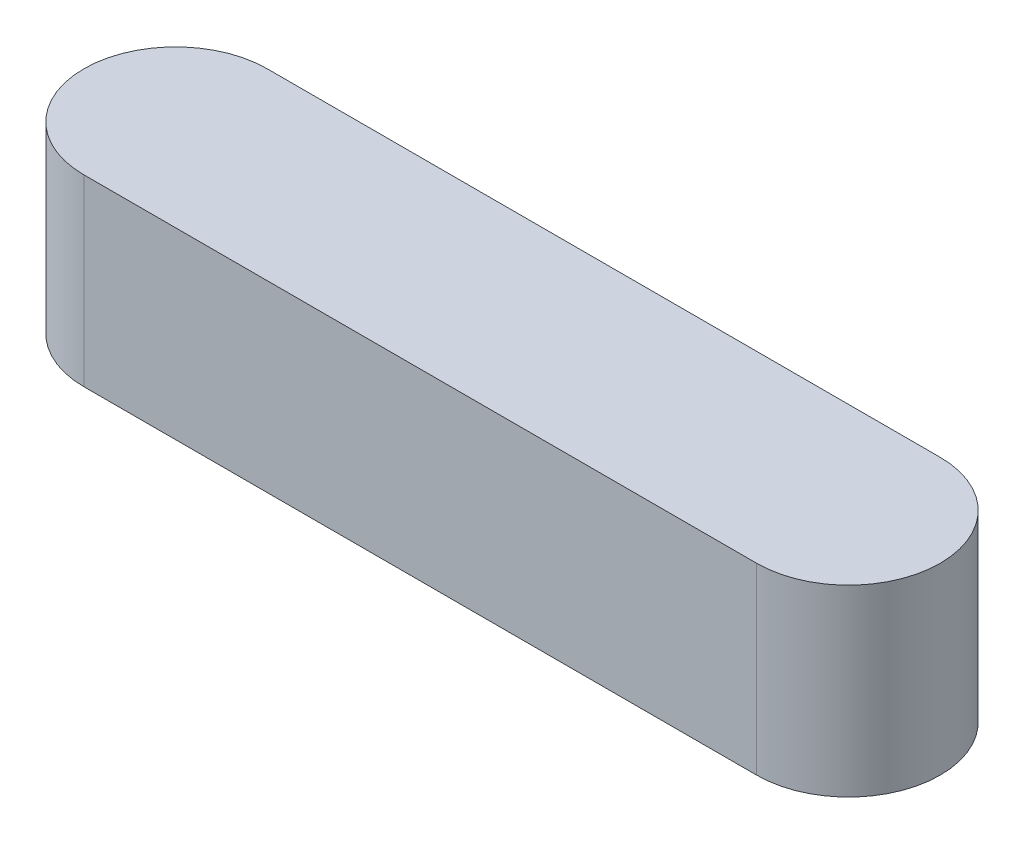
ISO-10303-21;
HEADER;
FILE_DESCRIPTION(('STEP AP214'),'2;1');
FILE_NAME('part.step','',(''),(''),'','','');
FILE_SCHEMA(('AUTOMOTIVE_DESIGN { 1 0 10303 214 1 1 1 1 }'));
ENDSEC;
DATA;
#1=APPLICATION_CONTEXT('core data for automotive mechanical design processes');
#2=APPLICATION_PROTOCOL_DEFINITION('international standard','automotive_design',2000,#1);
#3=PRODUCT_CONTEXT('',#1,'mechanical');
#4=PRODUCT('Part','Part','',(#3));
#5=PRODUCT_RELATED_PRODUCT_CATEGORY('part','',(#4));
#6=PRODUCT_DEFINITION_FORMATION('','',#4);
#7=PRODUCT_DEFINITION_CONTEXT('part definition',#1,'design');
#8=PRODUCT_DEFINITION('design','',#6,#7);
#9=PRODUCT_DEFINITION_SHAPE('','',#8);
#10=(LENGTH_UNIT() NAMED_UNIT(*) SI_UNIT(.MILLI.,.METRE.));
#11=(NAMED_UNIT(*) PLANE_ANGLE_UNIT() SI_UNIT($,.RADIAN.));
#12=(NAMED_UNIT(*) SI_UNIT($,.STERADIAN.) SOLID_ANGLE_UNIT());
#13=UNCERTAINTY_MEASURE_WITH_UNIT(LENGTH_MEASURE(1.E-05),#10,'distance_accuracy_value','');
#14=(GEOMETRIC_REPRESENTATION_CONTEXT(3) GLOBAL_UNCERTAINTY_ASSIGNED_CONTEXT((#13)) GLOBAL_UNIT_ASSIGNED_CONTEXT((#10,
#11,#12)) REPRESENTATION_CONTEXT('',''));
#15=CARTESIAN_POINT('',(0.,0.,0.));
#16=DIRECTION('',(0.,0.,1.));
#17=DIRECTION('',(1.,0.,0.));
#18=AXIS2_PLACEMENT_3D('',#15,#16,#17);
#19=CARTESIAN_POINT('',(0.,3.,0.));
#20=DIRECTION('',(0.,-1.,0.));
#21=DIRECTION('',(0.,0.,-1.));
#22=AXIS2_PLACEMENT_3D('',#19,#20,#21);
#23=CYLINDRICAL_SURFACE('',#22,1.5);
#24=CARTESIAN_POINT('',(0.,0.,0.));
#25=DIRECTION('',(0.,1.,0.));
#26=DIRECTION('',(0.,0.,1.));
#27=AXIS2_PLACEMENT_3D('',#24,#25,#26);
#28=CIRCLE('',#27,1.5);
#29=CARTESIAN_POINT('',(0.,0.,-1.5));
#30=VERTEX_POINT('',#29);
#31=CARTESIAN_POINT('',(0.,0.,1.5));
#32=VERTEX_POINT('',#31);
#33=EDGE_CURVE('E102',#30,#32,#28,.T.);
#34=ORIENTED_EDGE('',*,*,#33,.T.);
#35=DIRECTION('',(0.,-1.,0.));
#36=VECTOR('',#35,1.);
#37=CARTESIAN_POINT('',(0.,3.,1.5));
#38=LINE('',#37,#36);
#39=CARTESIAN_POINT('',(0.,3.,1.5));
#40=VERTEX_POINT('',#39);
#41=EDGE_CURVE('E11',#40,#32,#38,.T.);
#42=ORIENTED_EDGE('',*,*,#41,.F.);
#43=CARTESIAN_POINT('',(0.,3.,0.));
#44=DIRECTION('',(0.,1.,0.));
#45=DIRECTION('',(0.,0.,1.));
#46=AXIS2_PLACEMENT_3D('',#43,#44,#45);
#47=CIRCLE('',#46,1.5);
#48=CARTESIAN_POINT('',(0.,3.,-1.5));
#49=VERTEX_POINT('',#48);
#50=EDGE_CURVE('E95',#49,#40,#47,.T.);
#51=ORIENTED_EDGE('',*,*,#50,.F.);
#52=DIRECTION('',(0.,-1.,0.));
#53=VECTOR('',#52,1.);
#54=CARTESIAN_POINT('',(0.,3.,-1.5));
#55=LINE('',#54,#53);
#56=EDGE_CURVE('E99',#49,#30,#55,.T.);
#57=ORIENTED_EDGE('',*,*,#56,.T.);
#58=EDGE_LOOP('',(#34,#42,#51,#57));
#59=FACE_BOUND('',#58,.T.);
#60=ADVANCED_FACE('F41',(#59),#23,.T.);
#61=CARTESIAN_POINT('',(0.,3.,1.5));
#62=DIRECTION('',(0.,0.,-1.));
#63=DIRECTION('',(-1.,0.,0.));
#64=AXIS2_PLACEMENT_3D('',#61,#62,#63);
#65=PLANE('',#64);
#66=DIRECTION('',(1.,0.,0.));
#67=VECTOR('',#66,1.);
#68=CARTESIAN_POINT('',(0.,0.,1.5));
#69=LINE('',#68,#67);
#70=CARTESIAN_POINT('',(11.,0.,1.5));
#71=VERTEX_POINT('',#70);
#72=EDGE_CURVE('E96',#32,#71,#69,.T.);
#73=ORIENTED_EDGE('',*,*,#72,.T.);
#74=DIRECTION('',(0.,-1.,0.));
#75=VECTOR('',#74,1.);
#76=CARTESIAN_POINT('',(11.,3.,1.5));
#77=LINE('',#76,#75);
#78=CARTESIAN_POINT('',(11.,3.,1.5));
#79=VERTEX_POINT('',#78);
#80=EDGE_CURVE('E47',#79,#71,#77,.T.);
#81=ORIENTED_EDGE('',*,*,#80,.F.);
#82=DIRECTION('',(1.,0.,0.));
#83=VECTOR('',#82,1.);
#84=CARTESIAN_POINT('',(0.,3.,1.5));
#85=LINE('',#84,#83);
#86=EDGE_CURVE('E87',#40,#79,#85,.T.);
#87=ORIENTED_EDGE('',*,*,#86,.F.);
#88=ORIENTED_EDGE('',*,*,#41,.T.);
#89=EDGE_LOOP('',(#73,#81,#87,#88));
#90=FACE_BOUND('',#89,.T.);
#91=ADVANCED_FACE('F92',(#90),#65,.F.);
#92=CARTESIAN_POINT('',(11.,3.,0.));
#93=DIRECTION('',(0.,-1.,0.));
#94=DIRECTION('',(0.,0.,-1.));
#95=AXIS2_PLACEMENT_3D('',#92,#93,#94);
#96=CYLINDRICAL_SURFACE('',#95,1.5);
#97=CARTESIAN_POINT('',(11.,0.,0.));
#98=DIRECTION('',(0.,1.,0.));
#99=DIRECTION('',(0.,0.,1.));
#100=AXIS2_PLACEMENT_3D('',#97,#98,#99);
#101=CIRCLE('',#100,1.5);
#102=CARTESIAN_POINT('',(11.,0.,-1.5));
#103=VERTEX_POINT('',#102);
#104=EDGE_CURVE('E74',#71,#103,#101,.T.);
#105=ORIENTED_EDGE('',*,*,#104,.T.);
#106=DIRECTION('',(0.,-1.,0.));
#107=VECTOR('',#106,1.);
#108=CARTESIAN_POINT('',(11.,3.,-1.5));
#109=LINE('',#108,#107);
#110=CARTESIAN_POINT('',(11.,3.,-1.5));
#111=VERTEX_POINT('',#110);
#112=EDGE_CURVE('E100',#111,#103,#109,.T.);
#113=ORIENTED_EDGE('',*,*,#112,.F.);
#114=CARTESIAN_POINT('',(11.,3.,0.));
#115=DIRECTION('',(0.,1.,0.));
#116=DIRECTION('',(0.,0.,1.));
#117=AXIS2_PLACEMENT_3D('',#114,#115,#116);
#118=CIRCLE('',#117,1.5);
#119=EDGE_CURVE('E89',#79,#111,#118,.T.);
#120=ORIENTED_EDGE('',*,*,#119,.F.);
#121=ORIENTED_EDGE('',*,*,#80,.T.);
#122=EDGE_LOOP('',(#105,#113,#120,#121));
#123=FACE_BOUND('',#122,.T.);
#124=ADVANCED_FACE('F98',(#123),#96,.T.);
#125=CARTESIAN_POINT('',(0.,3.,-1.5));
#126=DIRECTION('',(0.,0.,1.));
#127=DIRECTION('',(1.,0.,0.));
#128=AXIS2_PLACEMENT_3D('',#125,#126,#127);
#129=PLANE('',#128);
#130=DIRECTION('',(-1.,0.,0.));
#131=VECTOR('',#130,1.);
#132=CARTESIAN_POINT('',(0.,0.,-1.5));
#133=LINE('',#132,#131);
#134=EDGE_CURVE('E79',#103,#30,#133,.T.);
#135=ORIENTED_EDGE('',*,*,#134,.T.);
#136=ORIENTED_EDGE('',*,*,#56,.F.);
#137=DIRECTION('',(-1.,0.,0.));
#138=VECTOR('',#137,1.);
#139=CARTESIAN_POINT('',(0.,3.,-1.5));
#140=LINE('',#139,#138);
#141=EDGE_CURVE('E60',#111,#49,#140,.T.);
#142=ORIENTED_EDGE('',*,*,#141,.F.);
#143=ORIENTED_EDGE('',*,*,#112,.T.);
#144=EDGE_LOOP('',(#135,#136,#142,#143));
#145=FACE_BOUND('',#144,.T.);
#146=ADVANCED_FACE('F112',(#145),#129,.F.);
#147=CARTESIAN_POINT('',(0.,3.,0.));
#148=DIRECTION('',(0.,1.,0.));
#149=DIRECTION('',(0.,0.,1.));
#150=AXIS2_PLACEMENT_3D('',#147,#148,#149);
#151=PLANE('',#150);
#152=ORIENTED_EDGE('',*,*,#50,.T.);
#153=ORIENTED_EDGE('',*,*,#86,.T.);
#154=ORIENTED_EDGE('',*,*,#119,.T.);
#155=ORIENTED_EDGE('',*,*,#141,.T.);
#156=EDGE_LOOP('',(#152,#153,#154,#155));
#157=FACE_BOUND('',#156,.T.);
#158=ADVANCED_FACE('F86',(#157),#151,.T.);
#159=CARTESIAN_POINT('',(0.,0.,0.));
#160=DIRECTION('',(0.,1.,0.));
#161=DIRECTION('',(0.,0.,1.));
#162=AXIS2_PLACEMENT_3D('',#159,#160,#161);
#163=PLANE('',#162);
#164=ORIENTED_EDGE('',*,*,#33,.F.);
#165=ORIENTED_EDGE('',*,*,#134,.F.);
#166=ORIENTED_EDGE('',*,*,#104,.F.);
#167=ORIENTED_EDGE('',*,*,#72,.F.);
#168=EDGE_LOOP('',(#164,#165,#166,#167));
#169=FACE_BOUND('',#168,.T.);
#170=ADVANCED_FACE('F111',(#169),#163,.F.);
#171=CLOSED_SHELL('',(#60,#91,#124,#146,#158,#170));
#172=MANIFOLD_SOLID_BREP('B2',#171);
#173=ADVANCED_BREP_SHAPE_REPRESENTATION('',(#18,#172),#14);
#174=SHAPE_DEFINITION_REPRESENTATION(#9,#173);
ENDSEC;
END-ISO-10303-21;
